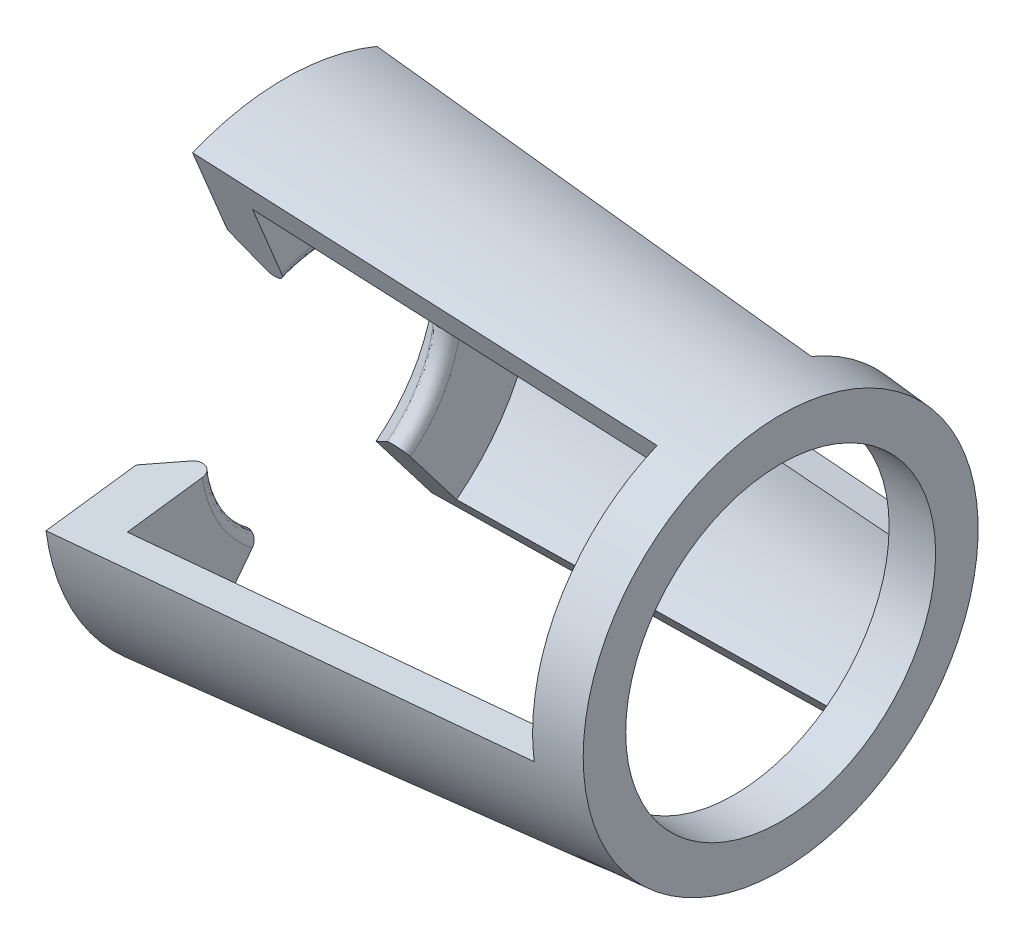
ISO-10303-21;
HEADER;
FILE_DESCRIPTION(('STEP AP214'),'2;1');
FILE_NAME('part.step','',(''),(''),'','','');
FILE_SCHEMA(('AUTOMOTIVE_DESIGN { 1 0 10303 214 1 1 1 1 }'));
ENDSEC;
DATA;
#1=APPLICATION_CONTEXT('core data for automotive mechanical design processes');
#2=APPLICATION_PROTOCOL_DEFINITION('international standard','automotive_design',2000,#1);
#3=PRODUCT_CONTEXT('',#1,'mechanical');
#4=PRODUCT('Part','Part','',(#3));
#5=PRODUCT_RELATED_PRODUCT_CATEGORY('part','',(#4));
#6=PRODUCT_DEFINITION_FORMATION('','',#4);
#7=PRODUCT_DEFINITION_CONTEXT('part definition',#1,'design');
#8=PRODUCT_DEFINITION('design','',#6,#7);
#9=PRODUCT_DEFINITION_SHAPE('','',#8);
#10=(LENGTH_UNIT() NAMED_UNIT(*) SI_UNIT(.MILLI.,.METRE.));
#11=(NAMED_UNIT(*) PLANE_ANGLE_UNIT() SI_UNIT($,.RADIAN.));
#12=(NAMED_UNIT(*) SI_UNIT($,.STERADIAN.) SOLID_ANGLE_UNIT());
#13=UNCERTAINTY_MEASURE_WITH_UNIT(LENGTH_MEASURE(1.E-05),#10,'distance_accuracy_value','');
#14=(GEOMETRIC_REPRESENTATION_CONTEXT(3) GLOBAL_UNCERTAINTY_ASSIGNED_CONTEXT((#13)) GLOBAL_UNIT_ASSIGNED_CONTEXT((#10,
#11,#12)) REPRESENTATION_CONTEXT('',''));
#15=CARTESIAN_POINT('',(0.,0.,0.));
#16=DIRECTION('',(0.,0.,1.));
#17=DIRECTION('',(1.,0.,0.));
#18=AXIS2_PLACEMENT_3D('',#15,#16,#17);
#19=CARTESIAN_POINT('',(0.75,-1.75521048802579,1.14446389126409));
#20=CARTESIAN_POINT('',(0.75,-1.72700261413181,1.18794201607092));
#21=CARTESIAN_POINT('',(0.75,-1.69609819179004,1.23175978207235));
#22=CARTESIAN_POINT('',(0.75,-1.32579916049826,1.71434282399508));
#23=CARTESIAN_POINT('',(0.75,-0.821764856126001,2.00534716530499));
#24=CARTESIAN_POINT('',(0.75,-0.218686166739589,2.08474401243922));
#25=CARTESIAN_POINT('',(0.75,-0.165286657074375,2.08959914427567));
#26=CARTESIAN_POINT('',(0.75,-0.11352955953576,2.09228881725127));
#27=CARTESIAN_POINT('',(0.750000000004493,-1.60300332677042,1.03923868519122));
#28=CARTESIAN_POINT('',(0.749999999662612,-1.57545568357828,1.08179000365184));
#29=CARTESIAN_POINT('',(0.74999999999999,-1.54626907845391,1.12308060245716));
#30=CARTESIAN_POINT('',(0.750000000000111,-1.20937959969953,1.56212352821814));
#31=CARTESIAN_POINT('',(0.749999999999891,-0.748148859435819,1.82841522026753));
#32=CARTESIAN_POINT('',(0.750000000000011,-0.199481792998441,1.90064860425603));
#33=CARTESIAN_POINT('',(0.749999999662585,-0.14912978293337,1.90527964634122));
#34=CARTESIAN_POINT('',(0.750000000004493,-0.098505438585886,1.90786094592976));
#35=CARTESIAN_POINT('',(0.579039085662711,-1.54477074274561,0.998980818191869));
#36=CARTESIAN_POINT('',(0.579064005045107,-1.51745422273521,1.04116597196559));
#37=CARTESIAN_POINT('',(0.579057233771362,-1.48893195908329,1.08149088096123));
#38=CARTESIAN_POINT('',(0.579057233576464,-1.16482776298836,1.50387172538826));
#39=CARTESIAN_POINT('',(0.579057233576354,-0.719977236724321,1.76070629647571));
#40=CARTESIAN_POINT('',(0.579057233771372,-0.192132597331981,1.83019834155326));
#41=CARTESIAN_POINT('',(0.579064005045108,-0.142949069910447,1.8347368919514));
#42=CARTESIAN_POINT('',(0.579039085662712,-0.0927573950746831,1.83730111533659));
#43=CARTESIAN_POINT('',(0.448224008012147,-1.65241976607726,1.07340169675101));
#44=CARTESIAN_POINT('',(0.44822303531754,-1.6246045938438,1.11622281132804));
#45=CARTESIAN_POINT('',(0.448223304437407,-1.5948771409127,1.15833866566105));
#46=CARTESIAN_POINT('',(0.448223307362948,-1.24714882637124,1.61150702322105));
#47=CARTESIAN_POINT('',(0.448223307362905,-0.772031607300428,1.88581607754808));
#48=CARTESIAN_POINT('',(0.448223304437412,-0.20571214019189,1.96037345277601));
#49=CARTESIAN_POINT('',(0.448223035317571,-0.154375013971805,1.96506025503762));
#50=CARTESIAN_POINT('',(0.448224008012147,-0.103383254813024,1.96773834351396));
#51=(BOUNDED_SURFACE() B_SPLINE_SURFACE(3,3,((#19,#20,#21,#22,#23,#24,#25,#26),(#27,#28,#29,#30,
#31,#32,#33,#34),(#35,#36,#37,#38,#39,#40,#41,#42),(#43,#44,#45,#46,#47,#48,#49,#50)),
.UNSPECIFIED.,.F.,.F.,.F.) B_SPLINE_SURFACE_WITH_KNOTS((4,4),(4,2,2,4),(0.,1.),
(-0.0999999999999994,0.,1.,1.1),
.UNSPECIFIED.) GEOMETRIC_REPRESENTATION_ITEM() RATIONAL_B_SPLINE_SURFACE(((1.,1.,1.,1.,1.,1.,1.,
1.),(0.588391783679867,0.588470534358269,0.588455621701443,0.588455620329532,0.588455620330206,
0.588455621701376,0.588470534358318,0.588391783679866),(0.588391783679867,0.588470534358269,
0.588455621701443,0.588455620329532,0.588455620330206,0.588455621701376,0.588470534358318,
0.588391783679866),(1.,1.,1.,1.,1.,1.,1.,1.))) REPRESENTATION_ITEM('') SURFACE());
#52=CARTESIAN_POINT('',(0.448224008012147,-1.65241976607726,1.07340169675101));
#53=CARTESIAN_POINT('',(0.44822303531754,-1.6246045938438,1.11622281132804));
#54=CARTESIAN_POINT('',(0.448223304437407,-1.5948771409127,1.15833866566105));
#55=CARTESIAN_POINT('',(0.448223307362948,-1.24714882637124,1.61150702322105));
#56=CARTESIAN_POINT('',(0.448223307362905,-0.772031607300428,1.88581607754808));
#57=CARTESIAN_POINT('',(0.448223304437412,-0.20571214019189,1.96037345277601));
#58=CARTESIAN_POINT('',(0.448223035317571,-0.154375013971805,1.96506025503762));
#59=CARTESIAN_POINT('',(0.448224008012147,-0.103383254813024,1.96773834351396));
#60=(BOUNDED_CURVE() B_SPLINE_CURVE(3,(#52,#53,#54,#55,#56,#57,#58,#59),.UNSPECIFIED.,.F.,
.F.) B_SPLINE_CURVE_WITH_KNOTS((4,2,2,4),(-0.0999999999999994,0.,1.,1.1),
.UNSPECIFIED.) CURVE() GEOMETRIC_REPRESENTATION_ITEM() RATIONAL_B_SPLINE_CURVE((1.,1.,1.,1.,1.,
1.,1.,1.)) REPRESENTATION_ITEM(''));
#61=CARTESIAN_POINT('',(0.448223304703364,-0.257195728110849,1.95359550957347));
#62=VERTEX_POINT('',#61);
#63=CARTESIAN_POINT('',(0.448147474307576,-1.56332563625218,1.1995819516957));
#64=VERTEX_POINT('',#63);
#65=EDGE_CURVE('E678',#62,#64,#60,.F.);
#66=CARTESIAN_POINT('',(0.448223304703366,-0.257195728110849,1.95359550957347));
#67=CARTESIAN_POINT('',(0.579057233753643,-0.240118473538728,1.82388088292323));
#68=CARTESIAN_POINT('',(0.75,-0.249360617114364,1.89408193299826));
#69=CARTESIAN_POINT('',(0.75,-0.273511502138354,2.0775261172452));
#70=(BOUNDED_CURVE() B_SPLINE_CURVE(3,(#66,#67,#68,#69),.UNSPECIFIED.,.F.,
.F.) B_SPLINE_CURVE_WITH_KNOTS((4,4),(0.,1.),
.UNSPECIFIED.) CURVE() GEOMETRIC_REPRESENTATION_ITEM() RATIONAL_B_SPLINE_CURVE((1.,
0.588455621576724,0.588455621576724,1.)) REPRESENTATION_ITEM(''));
#71=CARTESIAN_POINT('',(0.75,-0.273511502138354,2.0775261172452));
#72=VERTEX_POINT('',#71);
#73=EDGE_CURVE('E58',#72,#62,#70,.F.);
#74=CARTESIAN_POINT('',(0.75,-0.11352955953576,2.09228881725127));
#75=CARTESIAN_POINT('',(0.75,-0.165286657074375,2.08959914427567));
#76=CARTESIAN_POINT('',(0.75,-0.218686166739589,2.08474401243922));
#77=CARTESIAN_POINT('',(0.75,-0.821764856126001,2.00534716530499));
#78=CARTESIAN_POINT('',(0.75,-1.32579916049826,1.71434282399508));
#79=CARTESIAN_POINT('',(0.75,-1.69609819179004,1.23175978207235));
#80=CARTESIAN_POINT('',(0.75,-1.72700261413181,1.18794201607092));
#81=CARTESIAN_POINT('',(0.75,-1.75521048802579,1.14446389126409));
#82=(BOUNDED_CURVE() B_SPLINE_CURVE(3,(#74,#75,#76,#77,#78,#79,#80,#81),.UNSPECIFIED.,.F.,
.F.) B_SPLINE_CURVE_WITH_KNOTS((4,2,2,4),(-0.0999999999999994,0.,1.,1.1),
.UNSPECIFIED.) CURVE() GEOMETRIC_REPRESENTATION_ITEM() RATIONAL_B_SPLINE_CURVE((1.,1.,1.,1.,1.,
1.,1.,1.)) REPRESENTATION_ITEM(''));
#83=CARTESIAN_POINT('',(0.75,-1.66243464349079,1.27563096770169));
#84=VERTEX_POINT('',#83);
#85=EDGE_CURVE('E251',#84,#72,#82,.F.);
#86=CARTESIAN_POINT('',(0.75,-1.66243464349079,1.27563096770169));
#87=CARTESIAN_POINT('',(0.750000000000001,-1.51564276226842,1.16299359562356));
#88=CARTESIAN_POINT('',(0.579057233753644,-1.45946794131892,1.11988913946412));
#89=CARTESIAN_POINT('',(0.448223304703365,-1.56326547595439,1.1995357890756));
#90=(BOUNDED_CURVE() B_SPLINE_CURVE(3,(#86,#87,#88,#89),.UNSPECIFIED.,.F.,
.F.) B_SPLINE_CURVE_WITH_KNOTS((4,4),(0.,1.),
.UNSPECIFIED.) CURVE() GEOMETRIC_REPRESENTATION_ITEM() RATIONAL_B_SPLINE_CURVE((1.,
0.588455621576723,0.588455621576723,1.)) REPRESENTATION_ITEM(''));
#91=EDGE_CURVE('E11',#64,#84,#90,.F.);
#92=ORIENTED_EDGE('',*,*,#65,.F.);
#93=ORIENTED_EDGE('',*,*,#73,.F.);
#94=ORIENTED_EDGE('',*,*,#85,.F.);
#95=ORIENTED_EDGE('',*,*,#91,.F.);
#96=EDGE_LOOP('',(#92,#93,#94,#95));
#97=FACE_BOUND('',#96,.T.);
#98=ADVANCED_FACE('F44',(#97),#51,.T.);
#99=CARTESIAN_POINT('',(0.75,-0.113529559535791,-2.09228881725127));
#100=CARTESIAN_POINT('',(0.75,-0.165286657074389,-2.08959914427568));
#101=CARTESIAN_POINT('',(0.75,-0.218686166739633,-2.08474401243919));
#102=CARTESIAN_POINT('',(0.75,-0.821764856125882,-2.00534716530522));
#103=CARTESIAN_POINT('',(0.75,-1.32579916049847,-1.71434282399487));
#104=CARTESIAN_POINT('',(0.75,-1.69609819179004,-1.23175978207234));
#105=CARTESIAN_POINT('',(0.75,-1.72700261413187,-1.18794201607091));
#106=CARTESIAN_POINT('',(0.75,-1.75521048802581,-1.14446389126407));
#107=CARTESIAN_POINT('',(0.750000000004493,-0.0985054385859135,-1.90786094592976));
#108=CARTESIAN_POINT('',(0.749999999662618,-0.149129782933395,-1.90527964634124));
#109=CARTESIAN_POINT('',(0.750000000000022,-0.199481792998454,-1.900648604256));
#110=CARTESIAN_POINT('',(0.749999999999781,-0.748148859435051,-1.82841522026792));
#111=CARTESIAN_POINT('',(0.750000000000192,-1.2093795996997,-1.56212352821791));
#112=CARTESIAN_POINT('',(0.749999999999981,-1.54626907845392,-1.12308060245715));
#113=CARTESIAN_POINT('',(0.749999999662637,-1.57545568357831,-1.08179000365182));
#114=CARTESIAN_POINT('',(0.750000000004493,-1.60300332677044,-1.03923868519119));
#115=CARTESIAN_POINT('',(0.579039085662711,-0.0927573950747094,-1.83730111533659));
#116=CARTESIAN_POINT('',(0.579064005045132,-0.14294906991049,-1.83473689195137));
#117=CARTESIAN_POINT('',(0.57905723377138,-0.192132597331967,-1.83019834155325));
#118=CARTESIAN_POINT('',(0.579057233576271,-0.719977236723854,-1.76070629647593));
#119=CARTESIAN_POINT('',(0.579057233576545,-1.16482776298852,-1.50387172538781));
#120=CARTESIAN_POINT('',(0.579057233771352,-1.4889319590833,-1.08149088096124));
#121=CARTESIAN_POINT('',(0.579064005045151,-1.51745422273521,-1.04116597196552));
#122=CARTESIAN_POINT('',(0.579039085662711,-1.54477074274562,-0.998980818191847));
#123=CARTESIAN_POINT('',(0.448224008012146,-0.103383254813053,-1.96773834351396));
#124=CARTESIAN_POINT('',(0.448223035317593,-0.154375013971845,-1.9650602550376));
#125=CARTESIAN_POINT('',(0.448223304437421,-0.205712140191897,-1.960373452776));
#126=CARTESIAN_POINT('',(0.448223307362796,-0.772031607300662,-1.88581607754815));
#127=CARTESIAN_POINT('',(0.448223307363019,-1.24714882637144,-1.61150702322069));
#128=CARTESIAN_POINT('',(0.448223304437398,-1.5948771409127,-1.15833866566106));
#129=CARTESIAN_POINT('',(0.448223035317566,-1.62460459384381,-1.11622281132798));
#130=CARTESIAN_POINT('',(0.448224008012146,-1.65241976607728,-1.07340169675099));
#131=(BOUNDED_SURFACE() B_SPLINE_SURFACE(3,3,((#99,#100,#101,#102,#103,#104,#105,#106),(#107,
#108,#109,#110,#111,#112,#113,#114),(#115,#116,#117,#118,#119,#120,#121,#122),(#123,#124,#125,
#126,#127,#128,#129,#130)),.UNSPECIFIED.,.F.,.F.,.F.) B_SPLINE_SURFACE_WITH_KNOTS((4,4),(4,2,2,
4),(0.,1.),(-0.1,0.,1.,1.1),
.UNSPECIFIED.) GEOMETRIC_REPRESENTATION_ITEM() RATIONAL_B_SPLINE_SURFACE(((1.,1.,1.,1.,1.,1.,1.,
1.),(0.588391783679867,0.588470534358391,0.588455621701277,0.588455620331218,0.588455620329647,
0.588455621701434,0.588470534358274,0.588391783679867),(0.588391783679867,0.588470534358391,
0.588455621701277,0.588455620331218,0.588455620329647,0.588455621701434,0.588470534358274,
0.588391783679867),(1.,1.,1.,1.,1.,1.,1.,1.))) REPRESENTATION_ITEM('') SURFACE());
#132=CARTESIAN_POINT('',(0.448224008012146,-0.103383254813053,-1.96773834351396));
#133=CARTESIAN_POINT('',(0.448223035317593,-0.154375013971845,-1.9650602550376));
#134=CARTESIAN_POINT('',(0.448223304437421,-0.205712140191897,-1.960373452776));
#135=CARTESIAN_POINT('',(0.448223307362796,-0.772031607300662,-1.88581607754815));
#136=CARTESIAN_POINT('',(0.448223307363019,-1.24714882637144,-1.61150702322069));
#137=CARTESIAN_POINT('',(0.448223304437398,-1.5948771409127,-1.15833866566106));
#138=CARTESIAN_POINT('',(0.448223035317566,-1.62460459384381,-1.11622281132798));
#139=CARTESIAN_POINT('',(0.448224008012146,-1.65241976607728,-1.07340169675099));
#140=(BOUNDED_CURVE() B_SPLINE_CURVE(3,(#132,#133,#134,#135,#136,#137,#138,#139),.UNSPECIFIED.,
.F.,.F.) B_SPLINE_CURVE_WITH_KNOTS((4,2,2,4),(-0.1,0.,1.,1.1),
.UNSPECIFIED.) CURVE() GEOMETRIC_REPRESENTATION_ITEM() RATIONAL_B_SPLINE_CURVE((1.,1.,1.,1.,1.,
1.,1.,1.)) REPRESENTATION_ITEM(''));
#141=CARTESIAN_POINT('',(0.448223304703363,-1.56326547595441,-1.19953578907558));
#142=VERTEX_POINT('',#141);
#143=CARTESIAN_POINT('',(0.448147474313208,-0.257205625962958,-1.95367069122413));
#144=VERTEX_POINT('',#143);
#145=EDGE_CURVE('E311',#142,#144,#140,.F.);
#146=CARTESIAN_POINT('',(0.448223304703364,-1.5632654759544,-1.19953578907558));
#147=CARTESIAN_POINT('',(0.579057233753642,-1.45946794131894,-1.1198891394641));
#148=CARTESIAN_POINT('',(0.75,-1.51564276226844,-1.16299359562354));
#149=CARTESIAN_POINT('',(0.75,-1.66243464349081,-1.27563096770166));
#150=(BOUNDED_CURVE() B_SPLINE_CURVE(3,(#146,#147,#148,#149),.UNSPECIFIED.,.F.,
.F.) B_SPLINE_CURVE_WITH_KNOTS((4,4),(0.,1.),
.UNSPECIFIED.) CURVE() GEOMETRIC_REPRESENTATION_ITEM() RATIONAL_B_SPLINE_CURVE((1.,
0.588455621576726,0.588455621576726,1.)) REPRESENTATION_ITEM(''));
#151=CARTESIAN_POINT('',(0.75,-1.66243464349081,-1.27563096770167));
#152=VERTEX_POINT('',#151);
#153=EDGE_CURVE('E714',#152,#142,#150,.F.);
#154=CARTESIAN_POINT('',(0.75,-1.75521048802581,-1.14446389126407));
#155=CARTESIAN_POINT('',(0.75,-1.72700261413187,-1.18794201607091));
#156=CARTESIAN_POINT('',(0.75,-1.69609819179004,-1.23175978207234));
#157=CARTESIAN_POINT('',(0.75,-1.32579916049847,-1.71434282399487));
#158=CARTESIAN_POINT('',(0.75,-0.821764856125882,-2.00534716530522));
#159=CARTESIAN_POINT('',(0.75,-0.218686166739633,-2.08474401243919));
#160=CARTESIAN_POINT('',(0.75,-0.165286657074389,-2.08959914427568));
#161=CARTESIAN_POINT('',(0.75,-0.113529559535791,-2.09228881725127));
#162=(BOUNDED_CURVE() B_SPLINE_CURVE(3,(#154,#155,#156,#157,#158,#159,#160,#161),.UNSPECIFIED.,
.F.,.F.) B_SPLINE_CURVE_WITH_KNOTS((4,2,2,4),(-0.1,0.,1.,1.1),
.UNSPECIFIED.) CURVE() GEOMETRIC_REPRESENTATION_ITEM() RATIONAL_B_SPLINE_CURVE((1.,1.,1.,1.,1.,
1.,1.,1.)) REPRESENTATION_ITEM(''));
#163=CARTESIAN_POINT('',(0.75,-0.273511502138383,-2.0775261172452));
#164=VERTEX_POINT('',#163);
#165=EDGE_CURVE('E610',#164,#152,#162,.F.);
#166=CARTESIAN_POINT('',(0.75,-0.273511502138383,-2.0775261172452));
#167=CARTESIAN_POINT('',(0.75,-0.249360617114391,-1.89408193299826));
#168=CARTESIAN_POINT('',(0.579057233753642,-0.240118473538755,-1.82388088292323));
#169=CARTESIAN_POINT('',(0.448223304703364,-0.257195728110876,-1.95359550957347));
#170=(BOUNDED_CURVE() B_SPLINE_CURVE(3,(#166,#167,#168,#169),.UNSPECIFIED.,.F.,
.F.) B_SPLINE_CURVE_WITH_KNOTS((4,4),(0.,1.),
.UNSPECIFIED.) CURVE() GEOMETRIC_REPRESENTATION_ITEM() RATIONAL_B_SPLINE_CURVE((1.,
0.588455621576726,0.588455621576726,1.)) REPRESENTATION_ITEM(''));
#171=EDGE_CURVE('E297',#144,#164,#170,.F.);
#172=ORIENTED_EDGE('',*,*,#145,.F.);
#173=ORIENTED_EDGE('',*,*,#153,.F.);
#174=ORIENTED_EDGE('',*,*,#165,.F.);
#175=ORIENTED_EDGE('',*,*,#171,.F.);
#176=EDGE_LOOP('',(#172,#173,#174,#175));
#177=FACE_BOUND('',#176,.T.);
#178=ADVANCED_FACE('F318',(#177),#131,.T.);
#179=CARTESIAN_POINT('',(0.75,1.86874004756158,0.947824925987188));
#180=CARTESIAN_POINT('',(0.75,1.89228927120617,0.901657128204834));
#181=CARTESIAN_POINT('',(0.75,1.91478435852967,0.852984230366848));
#182=CARTESIAN_POINT('',(0.75,2.14756401662422,0.291004341310283));
#183=CARTESIAN_POINT('',(0.75,2.14756401662418,-0.291004341310247));
#184=CARTESIAN_POINT('',(0.75,1.91478435852967,-0.852984230366852));
#185=CARTESIAN_POINT('',(0.75,1.89228927120622,-0.901657128204855));
#186=CARTESIAN_POINT('',(0.75,1.86874004756158,-0.947824925987188));
#187=CARTESIAN_POINT('',(0.750000000004493,1.70150876535633,0.86862226073856));
#188=CARTESIAN_POINT('',(0.749999999662634,1.72458546651165,0.823489642689456));
#189=CARTESIAN_POINT('',(0.75,1.74575087145239,0.777568001798872));
#190=CARTESIAN_POINT('',(0.75,1.95752845913577,0.266291692050009));
#191=CARTESIAN_POINT('',(0.75,1.95752845913567,-0.266291692050141));
#192=CARTESIAN_POINT('',(0.75,1.7457508714524,-0.777568001798859));
#193=CARTESIAN_POINT('',(0.749999999662643,1.72458546651171,-0.823489642689499));
#194=CARTESIAN_POINT('',(0.750000000004493,1.70150876535633,-0.86862226073856));
#195=CARTESIAN_POINT('',(0.579039085662712,1.63752813782032,0.838320297144733));
#196=CARTESIAN_POINT('',(0.579064005045169,1.66040329264566,0.793570919985873));
#197=CARTESIAN_POINT('',(0.57905723377136,1.68106455641528,0.748707460592046));
#198=CARTESIAN_POINT('',(0.579057233576492,1.8848049997133,0.256834571087864));
#199=CARTESIAN_POINT('',(0.579057233576437,1.88480499971309,-0.256834571088024));
#200=CARTESIAN_POINT('',(0.579057233771365,1.6810645564153,-0.748707460592031));
#201=CARTESIAN_POINT('',(0.579064005045174,1.66040329264565,-0.793570919985891));
#202=CARTESIAN_POINT('',(0.579039085662712,1.63752813782032,-0.838320297144732));
#203=CARTESIAN_POINT('',(0.448224008012149,1.75580302089032,0.894336646762963));
#204=CARTESIAN_POINT('',(0.4482230353176,1.7789796078156,0.848837443709618));
#205=CARTESIAN_POINT('',(0.448223304437403,1.8005892811046,0.802034787114958));
#206=CARTESIAN_POINT('',(0.448223307363004,2.01918043367192,0.274309054327199));
#207=CARTESIAN_POINT('',(0.448223307363016,2.01918043367192,-0.27430905432718));
#208=CARTESIAN_POINT('',(0.448223304437402,1.8005892811046,-0.80203478711496));
#209=CARTESIAN_POINT('',(0.448223035317588,1.77897960781561,-0.848837443709621));
#210=CARTESIAN_POINT('',(0.448224008012149,1.75580302089032,-0.894336646762963));
#211=(BOUNDED_SURFACE() B_SPLINE_SURFACE(3,3,((#179,#180,#181,#182,#183,#184,#185,#186),(#187,
#188,#189,#190,#191,#192,#193,#194),(#195,#196,#197,#198,#199,#200,#201,#202),(#203,#204,#205,
#206,#207,#208,#209,#210)),.UNSPECIFIED.,.F.,.F.,.F.) B_SPLINE_SURFACE_WITH_KNOTS((4,4),(4,2,2,
4),(0.,1.),(-0.0999999999999999,0.,1.,1.1),
.UNSPECIFIED.) GEOMETRIC_REPRESENTATION_ITEM() RATIONAL_B_SPLINE_SURFACE(((1.,1.,1.,1.,1.,1.,1.,
1.),(0.588391783679867,0.588470534358312,0.588455621701384,0.588455620330153,0.588455620330153,
0.588455621701384,0.588470534358313,0.588391783679867),(0.588391783679867,0.588470534358312,
0.588455621701384,0.588455620330153,0.588455620330153,0.588455621701384,0.588470534358313,
0.588391783679867),(1.,1.,1.,1.,1.,1.,1.,1.))) REPRESENTATION_ITEM('') SURFACE());
#212=CARTESIAN_POINT('',(0.448224008012149,1.75580302089032,0.894336646762963));
#213=CARTESIAN_POINT('',(0.4482230353176,1.7789796078156,0.848837443709618));
#214=CARTESIAN_POINT('',(0.448223304437403,1.8005892811046,0.802034787114958));
#215=CARTESIAN_POINT('',(0.448223307363004,2.01918043367192,0.274309054327199));
#216=CARTESIAN_POINT('',(0.448223307363016,2.01918043367192,-0.27430905432718));
#217=CARTESIAN_POINT('',(0.448223304437402,1.8005892811046,-0.80203478711496));
#218=CARTESIAN_POINT('',(0.448223035317588,1.77897960781561,-0.848837443709621));
#219=CARTESIAN_POINT('',(0.448224008012149,1.75580302089032,-0.894336646762963));
#220=(BOUNDED_CURVE() B_SPLINE_CURVE(3,(#212,#213,#214,#215,#216,#217,#218,#219),.UNSPECIFIED.,
.F.,.F.) B_SPLINE_CURVE_WITH_KNOTS((4,2,2,4),(-0.0999999999999999,0.,1.,1.1),
.UNSPECIFIED.) CURVE() GEOMETRIC_REPRESENTATION_ITEM() RATIONAL_B_SPLINE_CURVE((1.,1.,1.,1.,1.,
1.,1.,1.)) REPRESENTATION_ITEM(''));
#221=CARTESIAN_POINT('',(0.448223304703366,1.82046120406527,-0.75405972049789));
#222=VERTEX_POINT('',#221);
#223=CARTESIAN_POINT('',(0.448147474312111,1.82053126221169,0.754088739532293));
#224=VERTEX_POINT('',#223);
#225=EDGE_CURVE('E445',#222,#224,#220,.F.);
#226=CARTESIAN_POINT('',(0.448223304703367,1.82046120406526,-0.754059720497889));
#227=CARTESIAN_POINT('',(0.579057233753644,1.69958641485768,-0.703991743459119));
#228=CARTESIAN_POINT('',(0.75,1.76500337938282,-0.73108833737471));
#229=CARTESIAN_POINT('',(0.75,1.93594614562917,-0.801895149543524));
#230=(BOUNDED_CURVE() B_SPLINE_CURVE(3,(#226,#227,#228,#229),.UNSPECIFIED.,.F.,
.F.) B_SPLINE_CURVE_WITH_KNOTS((4,4),(0.,1.),
.UNSPECIFIED.) CURVE() GEOMETRIC_REPRESENTATION_ITEM() RATIONAL_B_SPLINE_CURVE((1.,
0.588455621576727,0.588455621576727,1.)) REPRESENTATION_ITEM(''));
#231=CARTESIAN_POINT('',(0.75,1.93594614562918,-0.801895149543525));
#232=VERTEX_POINT('',#231);
#233=EDGE_CURVE('E440',#232,#222,#230,.F.);
#234=CARTESIAN_POINT('',(0.75,1.86874004756158,-0.947824925987188));
#235=CARTESIAN_POINT('',(0.75,1.89228927120622,-0.901657128204855));
#236=CARTESIAN_POINT('',(0.75,1.91478435852967,-0.852984230366852));
#237=CARTESIAN_POINT('',(0.75,2.14756401662418,-0.291004341310247));
#238=CARTESIAN_POINT('',(0.75,2.14756401662422,0.291004341310283));
#239=CARTESIAN_POINT('',(0.75,1.91478435852967,0.852984230366848));
#240=CARTESIAN_POINT('',(0.75,1.89228927120617,0.901657128204834));
#241=CARTESIAN_POINT('',(0.75,1.86874004756158,0.947824925987188));
#242=(BOUNDED_CURVE() B_SPLINE_CURVE(3,(#234,#235,#236,#237,#238,#239,#240,#241),.UNSPECIFIED.,
.F.,.F.) B_SPLINE_CURVE_WITH_KNOTS((4,2,2,4),(-0.0999999999999999,0.,1.,1.1),
.UNSPECIFIED.) CURVE() GEOMETRIC_REPRESENTATION_ITEM() RATIONAL_B_SPLINE_CURVE((1.,1.,1.,1.,1.,
1.,1.,1.)) REPRESENTATION_ITEM(''));
#243=CARTESIAN_POINT('',(0.75,1.93594614562918,0.801895149543526));
#244=VERTEX_POINT('',#243);
#245=EDGE_CURVE('E442',#244,#232,#242,.F.);
#246=CARTESIAN_POINT('',(0.75,1.93594614562917,0.801895149543525));
#247=CARTESIAN_POINT('',(0.75,1.76500337938282,0.731088337374711));
#248=CARTESIAN_POINT('',(0.579057233753644,1.69958641485768,0.703991743459119));
#249=CARTESIAN_POINT('',(0.448223304703367,1.82046120406526,0.754059720497889));
#250=(BOUNDED_CURVE() B_SPLINE_CURVE(3,(#246,#247,#248,#249),.UNSPECIFIED.,.F.,
.F.) B_SPLINE_CURVE_WITH_KNOTS((4,4),(0.,1.),
.UNSPECIFIED.) CURVE() GEOMETRIC_REPRESENTATION_ITEM() RATIONAL_B_SPLINE_CURVE((1.,
0.588455621576727,0.588455621576727,1.)) REPRESENTATION_ITEM(''));
#251=EDGE_CURVE('E451',#224,#244,#250,.F.);
#252=ORIENTED_EDGE('',*,*,#225,.F.);
#253=ORIENTED_EDGE('',*,*,#233,.F.);
#254=ORIENTED_EDGE('',*,*,#245,.F.);
#255=ORIENTED_EDGE('',*,*,#251,.F.);
#256=EDGE_LOOP('',(#252,#253,#254,#255));
#257=FACE_BOUND('',#256,.T.);
#258=ADVANCED_FACE('F331',(#257),#211,.T.);
#259=CARTESIAN_POINT('',(7.25,0.,0.));
#260=DIRECTION('',(-1.,0.,0.));
#261=DIRECTION('',(0.,0.,1.));
#262=AXIS2_PLACEMENT_3D('',#259,#260,#261);
#263=PLANE('',#262);
#264=DIRECTION('',(0.,-0.79335334029123,0.608761429008728));
#265=VECTOR('',#264,1.);
#266=CARTESIAN_POINT('',(7.25,0.,0.));
#267=LINE('',#266,#265);
#268=CARTESIAN_POINT('',(7.25,-2.18172168580088,1.674093929774));
#269=VERTEX_POINT('',#268);
#270=CARTESIAN_POINT('',(7.25,-2.57991359638369,1.9796373291591));
#271=VERTEX_POINT('',#270);
#272=EDGE_CURVE('E654',#269,#271,#267,.T.);
#273=ORIENTED_EDGE('',*,*,#272,.F.);
#274=CARTESIAN_POINT('',(7.25,0.,0.));
#275=DIRECTION('',(-1.,0.,0.));
#276=DIRECTION('',(0.,-0.866025403784443,-0.499999999999992));
#277=AXIS2_PLACEMENT_3D('',#274,#275,#276);
#278=CIRCLE('',#277,2.75);
#279=CARTESIAN_POINT('',(7.25,-0.358947028605114,2.72647336877798));
#280=VERTEX_POINT('',#279);
#281=EDGE_CURVE('E216',#269,#280,#278,.T.);
#282=ORIENTED_EDGE('',*,*,#281,.T.);
#283=DIRECTION('',(0.,-0.130526192220042,0.991444861373812));
#284=VECTOR('',#283,1.);
#285=CARTESIAN_POINT('',(7.25,0.,0.));
#286=LINE('',#285,#284);
#287=CARTESIAN_POINT('',(7.25,-0.424459419139851,3.22408937861671));
#288=VERTEX_POINT('',#287);
#289=EDGE_CURVE('E212',#280,#288,#286,.T.);
#290=ORIENTED_EDGE('',*,*,#289,.T.);
#291=CARTESIAN_POINT('',(7.25,0.,0.));
#292=DIRECTION('',(-1.,0.,0.));
#293=DIRECTION('',(0.,0.,1.));
#294=AXIS2_PLACEMENT_3D('',#291,#292,#293);
#295=CIRCLE('',#294,3.25190991877167);
#296=CARTESIAN_POINT('',(7.25,3.00437301552359,1.24445204945763));
#297=VERTEX_POINT('',#296);
#298=EDGE_CURVE('E193',#288,#297,#295,.T.);
#299=ORIENTED_EDGE('',*,*,#298,.T.);
#300=DIRECTION('',(0.,0.923879532511287,0.382683432365091));
#301=VECTOR('',#300,1.);
#302=CARTESIAN_POINT('',(7.25,0.,0.));
#303=LINE('',#302,#301);
#304=CARTESIAN_POINT('',(7.25,2.54066871440604,1.052379439004));
#305=VERTEX_POINT('',#304);
#306=EDGE_CURVE('E473',#305,#297,#303,.T.);
#307=ORIENTED_EDGE('',*,*,#306,.F.);
#308=CARTESIAN_POINT('',(7.25,0.,0.));
#309=DIRECTION('',(-1.,0.,0.));
#310=DIRECTION('',(0.,0.,1.));
#311=AXIS2_PLACEMENT_3D('',#308,#309,#310);
#312=CIRCLE('',#311,2.75);
#313=CARTESIAN_POINT('',(7.25,2.54066871440604,-1.052379439004));
#314=VERTEX_POINT('',#313);
#315=EDGE_CURVE('E208',#305,#314,#312,.T.);
#316=ORIENTED_EDGE('',*,*,#315,.T.);
#317=DIRECTION('',(0.,0.923879532511287,-0.382683432365091));
#318=VECTOR('',#317,1.);
#319=CARTESIAN_POINT('',(7.25,0.,0.));
#320=LINE('',#319,#318);
#321=CARTESIAN_POINT('',(7.25,3.00437301552359,-1.24445204945763));
#322=VERTEX_POINT('',#321);
#323=EDGE_CURVE('E550',#314,#322,#320,.T.);
#324=ORIENTED_EDGE('',*,*,#323,.T.);
#325=CARTESIAN_POINT('',(7.25,-0.424459419139895,-3.2240893786167));
#326=VERTEX_POINT('',#325);
#327=EDGE_CURVE('E210',#322,#326,#295,.T.);
#328=ORIENTED_EDGE('',*,*,#327,.T.);
#329=DIRECTION('',(0.,-0.130526192220055,-0.99144486137381));
#330=VECTOR('',#329,1.);
#331=CARTESIAN_POINT('',(7.25,0.,0.));
#332=LINE('',#331,#330);
#333=CARTESIAN_POINT('',(7.25,-0.358947028605152,-2.72647336877798));
#334=VERTEX_POINT('',#333);
#335=EDGE_CURVE('E565',#334,#326,#332,.T.);
#336=ORIENTED_EDGE('',*,*,#335,.F.);
#337=CARTESIAN_POINT('',(7.25,0.,0.));
#338=DIRECTION('',(-1.,0.,0.));
#339=DIRECTION('',(0.,0.866025403784436,-0.500000000000004));
#340=AXIS2_PLACEMENT_3D('',#337,#338,#339);
#341=CIRCLE('',#340,2.75);
#342=CARTESIAN_POINT('',(7.25,-2.18172168580091,-1.67409392977397));
#343=VERTEX_POINT('',#342);
#344=EDGE_CURVE('E606',#334,#343,#341,.T.);
#345=ORIENTED_EDGE('',*,*,#344,.T.);
#346=DIRECTION('',(0.,-0.793353340291239,-0.608761429008717));
#347=VECTOR('',#346,1.);
#348=CARTESIAN_POINT('',(7.25,0.,0.));
#349=LINE('',#348,#347);
#350=CARTESIAN_POINT('',(7.25,-2.57991359638372,-1.97963732915906));
#351=VERTEX_POINT('',#350);
#352=EDGE_CURVE('E628',#343,#351,#349,.T.);
#353=ORIENTED_EDGE('',*,*,#352,.T.);
#354=EDGE_CURVE('E207',#351,#271,#295,.T.);
#355=ORIENTED_EDGE('',*,*,#354,.T.);
#356=EDGE_LOOP('',(#273,#282,#290,#299,#307,#316,#324,#328,#336,#345,#353,#355));
#357=FACE_BOUND('',#356,.T.);
#358=CARTESIAN_POINT('',(7.25,0.,0.));
#359=DIRECTION('',(-1.,0.,0.));
#360=DIRECTION('',(0.,0.,1.));
#361=AXIS2_PLACEMENT_3D('',#358,#359,#360);
#362=CIRCLE('',#361,2.5);
#363=CARTESIAN_POINT('',(7.25,0.,2.5));
#364=VERTEX_POINT('',#363);
#365=EDGE_CURVE('E511',#364,#364,#362,.T.);
#366=ORIENTED_EDGE('',*,*,#365,.F.);
#367=EDGE_LOOP('',(#366));
#368=FACE_BOUND('',#367,.T.);
#369=ADVANCED_FACE('F213',(#357,#368),#263,.T.);
#370=CARTESIAN_POINT('',(0.,0.,0.));
#371=DIRECTION('',(-1.,0.,0.));
#372=DIRECTION('',(0.,0.,1.));
#373=AXIS2_PLACEMENT_3D('',#370,#371,#372);
#374=CYLINDRICAL_SURFACE('',#373,2.5);
#375=ORIENTED_EDGE('',*,*,#365,.T.);
#376=EDGE_LOOP('',(#375));
#377=FACE_BOUND('',#376,.T.);
#378=CARTESIAN_POINT('',(8.,0.,0.));
#379=DIRECTION('',(-1.,0.,0.));
#380=DIRECTION('',(0.,0.,1.));
#381=AXIS2_PLACEMENT_3D('',#378,#379,#380);
#382=CIRCLE('',#381,2.5);
#383=CARTESIAN_POINT('',(8.,0.,2.5));
#384=VERTEX_POINT('',#383);
#385=EDGE_CURVE('E507',#384,#384,#382,.T.);
#386=ORIENTED_EDGE('',*,*,#385,.F.);
#387=EDGE_LOOP('',(#386));
#388=FACE_BOUND('',#387,.T.);
#389=ADVANCED_FACE('F752',(#377,#388),#374,.F.);
#390=CARTESIAN_POINT('',(8.,0.,0.));
#391=DIRECTION('',(1.,0.,0.));
#392=DIRECTION('',(0.,0.,-1.));
#393=AXIS2_PLACEMENT_3D('',#390,#391,#392);
#394=PLANE('',#393);
#395=ORIENTED_EDGE('',*,*,#385,.T.);
#396=EDGE_LOOP('',(#395));
#397=FACE_BOUND('',#396,.T.);
#398=CARTESIAN_POINT('',(8.,0.,0.));
#399=DIRECTION('',(-1.,0.,0.));
#400=DIRECTION('',(0.,0.,1.));
#401=AXIS2_PLACEMENT_3D('',#398,#399,#400);
#402=CIRCLE('',#401,3.18629342112723);
#403=CARTESIAN_POINT('',(8.,0.,3.18629342112723));
#404=VERTEX_POINT('',#403);
#405=EDGE_CURVE('E503',#404,#404,#402,.T.);
#406=ORIENTED_EDGE('',*,*,#405,.F.);
#407=EDGE_LOOP('',(#406));
#408=FACE_BOUND('',#407,.T.);
#409=ADVANCED_FACE('F758',(#397,#408),#394,.T.);
#410=CARTESIAN_POINT('',(7.25,0.,0.));
#411=DIRECTION('',(-1.,0.,0.));
#412=DIRECTION('',(0.,0.,1.));
#413=AXIS2_PLACEMENT_3D('',#410,#411,#412);
#414=CONICAL_SURFACE('',#413,3.25190991877167,0.0872664625997172);
#415=ORIENTED_EDGE('',*,*,#405,.T.);
#416=EDGE_LOOP('',(#415));
#417=FACE_BOUND('',#416,.T.);
#418=ORIENTED_EDGE('',*,*,#327,.F.);
#419=DIRECTION('',(0.996194698091746,-0.0805214068653807,0.0333530587850028));
#420=VECTOR('',#419,1.);
#421=CARTESIAN_POINT('',(0.337416010996605,3.56311016694175,-1.47588855537674));
#422=LINE('',#421,#420);
#423=CARTESIAN_POINT('',(0.,3.59038316082176,-1.48718539932836));
#424=VERTEX_POINT('',#423);
#425=EDGE_CURVE('E475',#424,#322,#422,.T.);
#426=ORIENTED_EDGE('',*,*,#425,.F.);
#427=CARTESIAN_POINT('',(0.,0.,0.));
#428=DIRECTION('',(-1.,0.,0.));
#429=DIRECTION('',(0.,0.,1.));
#430=AXIS2_PLACEMENT_3D('',#427,#428,#429);
#431=CIRCLE('',#430,3.88620272933463);
#432=CARTESIAN_POINT('',(0.,3.59038316082176,1.48718539932836));
#433=VERTEX_POINT('',#432);
#434=EDGE_CURVE('E495',#433,#424,#431,.T.);
#435=ORIENTED_EDGE('',*,*,#434,.F.);
#436=DIRECTION('',(0.996194698091746,-0.0805214068653807,-0.0333530587850028));
#437=VECTOR('',#436,1.);
#438=CARTESIAN_POINT('',(0.337416010996605,3.56311016694175,1.47588855537674));
#439=LINE('',#438,#437);
#440=EDGE_CURVE('E202',#433,#297,#439,.T.);
#441=ORIENTED_EDGE('',*,*,#440,.T.);
#442=ORIENTED_EDGE('',*,*,#298,.F.);
#443=DIRECTION('',(0.996194698091746,0.0113761072309614,-0.0864101132863839));
#444=VECTOR('',#443,1.);
#445=CARTESIAN_POINT('',(0.337416010996605,-0.503398101359868,3.82368819874254));
#446=LINE('',#445,#444);
#447=CARTESIAN_POINT('',(0.,-0.507251244455181,3.8529557262557));
#448=VERTEX_POINT('',#447);
#449=EDGE_CURVE('E199',#448,#288,#446,.T.);
#450=ORIENTED_EDGE('',*,*,#449,.F.);
#451=CARTESIAN_POINT('',(0.,0.,0.));
#452=DIRECTION('',(-1.,0.,0.));
#453=DIRECTION('',(0.,-0.866025403784443,-0.499999999999992));
#454=AXIS2_PLACEMENT_3D('',#451,#452,#453);
#455=CIRCLE('',#454,3.88620272933463);
#456=CARTESIAN_POINT('',(0.,-3.08313191636652,2.36577032692736));
#457=VERTEX_POINT('',#456);
#458=EDGE_CURVE('E641',#457,#448,#455,.T.);
#459=ORIENTED_EDGE('',*,*,#458,.F.);
#460=DIRECTION('',(0.996194698091746,0.069145299634418,-0.0530570545013816));
#461=VECTOR('',#460,1.);
#462=CARTESIAN_POINT('',(0.337416010996605,-3.05971206558183,2.34779964336583));
#463=LINE('',#462,#461);
#464=EDGE_CURVE('E651',#457,#271,#463,.T.);
#465=ORIENTED_EDGE('',*,*,#464,.T.);
#466=ORIENTED_EDGE('',*,*,#354,.F.);
#467=DIRECTION('',(0.996194698091746,0.0691452996344188,0.0530570545013807));
#468=VECTOR('',#467,1.);
#469=CARTESIAN_POINT('',(0.337416010996605,-3.05971206558186,-2.34779964336579));
#470=LINE('',#469,#468);
#471=CARTESIAN_POINT('',(0.,-3.08313191636655,-2.36577032692732));
#472=VERTEX_POINT('',#471);
#473=EDGE_CURVE('E633',#472,#351,#470,.T.);
#474=ORIENTED_EDGE('',*,*,#473,.F.);
#475=CARTESIAN_POINT('',(0.,0.,0.));
#476=DIRECTION('',(-1.,0.,0.));
#477=DIRECTION('',(0.,0.866025403784436,-0.500000000000004));
#478=AXIS2_PLACEMENT_3D('',#475,#476,#477);
#479=CIRCLE('',#478,3.88620272933463);
#480=CARTESIAN_POINT('',(0.,-0.507251244455235,-3.85295572625569));
#481=VERTEX_POINT('',#480);
#482=EDGE_CURVE('E561',#481,#472,#479,.T.);
#483=ORIENTED_EDGE('',*,*,#482,.F.);
#484=DIRECTION('',(0.996194698091746,0.0113761072309626,0.0864101132863838));
#485=VECTOR('',#484,1.);
#486=CARTESIAN_POINT('',(0.337416010996605,-0.503398101359921,-3.82368819874254));
#487=LINE('',#486,#485);
#488=EDGE_CURVE('E558',#481,#326,#487,.T.);
#489=ORIENTED_EDGE('',*,*,#488,.T.);
#490=EDGE_LOOP('',(#418,#426,#435,#441,#442,#450,#459,#465,#466,#474,#483,#489));
#491=FACE_BOUND('',#490,.T.);
#492=ADVANCED_FACE('F196',(#417,#491),#414,.T.);
#493=CARTESIAN_POINT('',(7.25,0.,0.));
#494=DIRECTION('',(-1.,0.,0.));
#495=DIRECTION('',(0.,0.,1.));
#496=AXIS2_PLACEMENT_3D('',#493,#494,#495);
#497=CONICAL_SURFACE('',#496,2.75,0.0872664625997165);
#498=ORIENTED_EDGE('',*,*,#315,.F.);
#499=DIRECTION('',(-0.996194698091746,0.0805214068653804,0.0333530587850027));
#500=VECTOR('',#499,1.);
#501=CARTESIAN_POINT('',(0.293838139622775,3.10292822096014,1.28527495219191));
#502=LINE('',#501,#500);
#503=CARTESIAN_POINT('',(0.75,3.06605712053543,1.27000244233638));
#504=VERTEX_POINT('',#503);
#505=EDGE_CURVE('E467',#305,#504,#502,.T.);
#506=ORIENTED_EDGE('',*,*,#505,.T.);
#507=CARTESIAN_POINT('',(0.75,0.,0.));
#508=DIRECTION('',(-1.,0.,0.));
#509=DIRECTION('',(0.,0.,1.));
#510=AXIS2_PLACEMENT_3D('',#507,#508,#509);
#511=CIRCLE('',#510,3.31867631291851);
#512=CARTESIAN_POINT('',(0.75,3.06605712053543,-1.27000244233638));
#513=VERTEX_POINT('',#512);
#514=EDGE_CURVE('E492',#504,#513,#511,.T.);
#515=ORIENTED_EDGE('',*,*,#514,.T.);
#516=DIRECTION('',(-0.996194698091746,0.0805214068653804,-0.0333530587850027));
#517=VECTOR('',#516,1.);
#518=CARTESIAN_POINT('',(0.293838139622775,3.10292822096014,-1.28527495219191));
#519=LINE('',#518,#517);
#520=EDGE_CURVE('E465',#314,#513,#519,.T.);
#521=ORIENTED_EDGE('',*,*,#520,.F.);
#522=EDGE_LOOP('',(#498,#506,#515,#521));
#523=FACE_BOUND('',#522,.T.);
#524=ADVANCED_FACE('F773',(#523),#497,.F.);
#525=CARTESIAN_POINT('',(0.,0.,0.));
#526=DIRECTION('',(-1.,0.,0.));
#527=DIRECTION('',(0.,0.,1.));
#528=AXIS2_PLACEMENT_3D('',#525,#526,#527);
#529=PLANE('',#528);
#530=DIRECTION('',(0.,0.923879532511287,-0.382683432365091));
#531=VECTOR('',#530,1.);
#532=CARTESIAN_POINT('',(0.,0.,0.));
#533=LINE('',#532,#531);
#534=CARTESIAN_POINT('',(0.,2.23456554127528,-0.925587353207798));
#535=VERTEX_POINT('',#534);
#536=EDGE_CURVE('E468',#535,#424,#533,.T.);
#537=ORIENTED_EDGE('',*,*,#536,.F.);
#538=CARTESIAN_POINT('',(0.,0.,0.));
#539=DIRECTION('',(-1.,0.,0.));
#540=DIRECTION('',(0.,0.,1.));
#541=AXIS2_PLACEMENT_3D('',#538,#539,#540);
#542=CIRCLE('',#541,2.41867631291851);
#543=CARTESIAN_POINT('',(0.,2.23456554127528,0.925587353207798));
#544=VERTEX_POINT('',#543);
#545=EDGE_CURVE('E518',#535,#544,#542,.F.);
#546=ORIENTED_EDGE('',*,*,#545,.T.);
#547=DIRECTION('',(0.,0.923879532511287,0.382683432365091));
#548=VECTOR('',#547,1.);
#549=CARTESIAN_POINT('',(0.,0.,0.));
#550=LINE('',#549,#548);
#551=EDGE_CURVE('E488',#544,#433,#550,.T.);
#552=ORIENTED_EDGE('',*,*,#551,.T.);
#553=ORIENTED_EDGE('',*,*,#434,.T.);
#554=EDGE_LOOP('',(#537,#546,#552,#553));
#555=FACE_BOUND('',#554,.T.);
#556=ADVANCED_FACE('F547',(#555),#529,.T.);
#557=CARTESIAN_POINT('',(0.75,0.,0.));
#558=DIRECTION('',(1.,0.,0.));
#559=DIRECTION('',(0.,0.,-1.));
#560=AXIS2_PLACEMENT_3D('',#557,#558,#559);
#561=PLANE('',#560);
#562=DIRECTION('',(0.,-0.923879532511287,-0.382683432365091));
#563=VECTOR('',#562,1.);
#564=CARTESIAN_POINT('',(0.75,0.,0.));
#565=LINE('',#564,#563);
#566=EDGE_CURVE('E458',#504,#244,#565,.T.);
#567=ORIENTED_EDGE('',*,*,#566,.T.);
#568=ORIENTED_EDGE('',*,*,#245,.T.);
#569=DIRECTION('',(0.,-0.923879532511287,0.382683432365091));
#570=VECTOR('',#569,1.);
#571=CARTESIAN_POINT('',(0.75,0.,0.));
#572=LINE('',#571,#570);
#573=EDGE_CURVE('E456',#513,#232,#572,.T.);
#574=ORIENTED_EDGE('',*,*,#573,.F.);
#575=ORIENTED_EDGE('',*,*,#514,.F.);
#576=EDGE_LOOP('',(#567,#568,#574,#575));
#577=FACE_BOUND('',#576,.T.);
#578=ADVANCED_FACE('F455',(#577),#561,.T.);
#579=CARTESIAN_POINT('',(0.,0.,0.));
#580=DIRECTION('',(0.,-0.382683432365091,0.923879532511287));
#581=DIRECTION('',(1.,0.,0.));
#582=AXIS2_PLACEMENT_3D('',#579,#580,#581);
#583=PLANE('',#582);
#584=DIRECTION('',(-0.707106781186547,0.653281482438189,0.270598050073099));
#585=VECTOR('',#584,1.);
#586=CARTESIAN_POINT('',(2.41867631291851,0.,0.));
#587=LINE('',#586,#585);
#588=EDGE_CURVE('E524',#544,#224,#587,.F.);
#589=ORIENTED_EDGE('',*,*,#588,.T.);
#590=ORIENTED_EDGE('',*,*,#251,.T.);
#591=ORIENTED_EDGE('',*,*,#566,.F.);
#592=ORIENTED_EDGE('',*,*,#505,.F.);
#593=ORIENTED_EDGE('',*,*,#306,.T.);
#594=ORIENTED_EDGE('',*,*,#440,.F.);
#595=ORIENTED_EDGE('',*,*,#551,.F.);
#596=EDGE_LOOP('',(#589,#590,#591,#592,#593,#594,#595));
#597=FACE_BOUND('',#596,.T.);
#598=ADVANCED_FACE('F539',(#597),#583,.T.);
#599=CARTESIAN_POINT('',(0.,0.,0.));
#600=DIRECTION('',(0.,0.382683432365091,0.923879532511287));
#601=DIRECTION('',(1.,0.,0.));
#602=AXIS2_PLACEMENT_3D('',#599,#600,#601);
#603=PLANE('',#602);
#604=ORIENTED_EDGE('',*,*,#573,.T.);
#605=ORIENTED_EDGE('',*,*,#233,.T.);
#606=DIRECTION('',(-0.707106781186547,0.653281482438189,-0.270598050073099));
#607=VECTOR('',#606,1.);
#608=CARTESIAN_POINT('',(2.41867631291851,0.,0.));
#609=LINE('',#608,#607);
#610=EDGE_CURVE('E515',#222,#535,#609,.T.);
#611=ORIENTED_EDGE('',*,*,#610,.T.);
#612=ORIENTED_EDGE('',*,*,#536,.T.);
#613=ORIENTED_EDGE('',*,*,#425,.T.);
#614=ORIENTED_EDGE('',*,*,#323,.F.);
#615=ORIENTED_EDGE('',*,*,#520,.T.);
#616=EDGE_LOOP('',(#604,#605,#611,#612,#613,#614,#615));
#617=FACE_BOUND('',#616,.T.);
#618=ADVANCED_FACE('F463',(#617),#603,.F.);
#619=CARTESIAN_POINT('',(0.500000000000003,0.,0.));
#620=DIRECTION('',(-1.,0.,0.));
#621=DIRECTION('',(0.,0.,1.));
#622=AXIS2_PLACEMENT_3D('',#619,#620,#621);
#623=CONICAL_SURFACE('',#622,1.91867631291851,0.785398163397449);
#624=ORIENTED_EDGE('',*,*,#610,.F.);
#625=ORIENTED_EDGE('',*,*,#225,.T.);
#626=ORIENTED_EDGE('',*,*,#588,.F.);
#627=ORIENTED_EDGE('',*,*,#545,.F.);
#628=EDGE_LOOP('',(#624,#625,#626,#627));
#629=FACE_BOUND('',#628,.T.);
#630=ADVANCED_FACE('F409',(#629),#623,.F.);
#631=CARTESIAN_POINT('',(7.25,0.,0.));
#632=DIRECTION('',(-1.,0.,0.));
#633=DIRECTION('',(0.,0.866025403784436,-0.500000000000004));
#634=AXIS2_PLACEMENT_3D('',#631,#632,#633);
#635=CONICAL_SURFACE('',#634,2.75,0.0872664625997165);
#636=ORIENTED_EDGE('',*,*,#344,.F.);
#637=DIRECTION('',(-0.996194698091746,-0.0113761072309625,-0.0864101132863835));
#638=VECTOR('',#637,1.);
#639=CARTESIAN_POINT('',(0.293838139622775,-0.438383351034059,-3.32985214156709));
#640=LINE('',#639,#638);
#641=CARTESIAN_POINT('',(0.75,-0.433174182336146,-3.29028457700604));
#642=VERTEX_POINT('',#641);
#643=EDGE_CURVE('E572',#334,#642,#640,.T.);
#644=ORIENTED_EDGE('',*,*,#643,.T.);
#645=CARTESIAN_POINT('',(0.75,0.,0.));
#646=DIRECTION('',(-1.,0.,0.));
#647=DIRECTION('',(0.,0.866025403784436,-0.500000000000004));
#648=AXIS2_PLACEMENT_3D('',#645,#646,#647);
#649=CIRCLE('',#648,3.31867631291851);
#650=CARTESIAN_POINT('',(0.75,-2.63288293819931,-2.02028213466965));
#651=VERTEX_POINT('',#650);
#652=EDGE_CURVE('E578',#642,#651,#649,.T.);
#653=ORIENTED_EDGE('',*,*,#652,.T.);
#654=DIRECTION('',(-0.996194698091746,-0.0691452996344186,-0.0530570545013805));
#655=VECTOR('',#654,1.);
#656=CARTESIAN_POINT('',(0.293838139622775,-2.66454486992611,-2.04457718937517));
#657=LINE('',#656,#655);
#658=EDGE_CURVE('E630',#343,#651,#657,.T.);
#659=ORIENTED_EDGE('',*,*,#658,.F.);
#660=EDGE_LOOP('',(#636,#644,#653,#659));
#661=FACE_BOUND('',#660,.T.);
#662=ADVANCED_FACE('F603',(#661),#635,.F.);
#663=CARTESIAN_POINT('',(0.,0.,0.));
#664=DIRECTION('',(-1.,0.,0.));
#665=DIRECTION('',(0.,0.866025403784436,-0.500000000000004));
#666=AXIS2_PLACEMENT_3D('',#663,#664,#665);
#667=PLANE('',#666);
#668=DIRECTION('',(0.,-0.793353340291239,-0.608761429008717));
#669=VECTOR('',#668,1.);
#670=CARTESIAN_POINT('',(0.,0.,0.));
#671=LINE('',#670,#669);
#672=CARTESIAN_POINT('',(0.,-1.9188649319372,-1.47239684856181));
#673=VERTEX_POINT('',#672);
#674=EDGE_CURVE('E592',#673,#472,#671,.T.);
#675=ORIENTED_EDGE('',*,*,#674,.F.);
#676=CARTESIAN_POINT('',(0.,0.,0.));
#677=DIRECTION('',(-1.,0.,0.));
#678=DIRECTION('',(0.,0.,1.));
#679=AXIS2_PLACEMENT_3D('',#676,#677,#678);
#680=CIRCLE('',#679,2.41867631291851);
#681=CARTESIAN_POINT('',(0.,-0.315700609338096,-2.39798420176961));
#682=VERTEX_POINT('',#681);
#683=EDGE_CURVE('E379',#673,#682,#680,.F.);
#684=ORIENTED_EDGE('',*,*,#683,.T.);
#685=DIRECTION('',(0.,-0.130526192220055,-0.99144486137381));
#686=VECTOR('',#685,1.);
#687=CARTESIAN_POINT('',(0.,0.,0.));
#688=LINE('',#687,#686);
#689=EDGE_CURVE('E564',#682,#481,#688,.T.);
#690=ORIENTED_EDGE('',*,*,#689,.T.);
#691=ORIENTED_EDGE('',*,*,#482,.T.);
#692=EDGE_LOOP('',(#675,#684,#690,#691));
#693=FACE_BOUND('',#692,.T.);
#694=ADVANCED_FACE('F726',(#693),#667,.T.);
#695=CARTESIAN_POINT('',(0.75,0.,0.));
#696=DIRECTION('',(1.,0.,0.));
#697=DIRECTION('',(0.,-0.866025403784436,0.500000000000004));
#698=AXIS2_PLACEMENT_3D('',#695,#696,#697);
#699=PLANE('',#698);
#700=DIRECTION('',(0.,0.130526192220055,0.99144486137381));
#701=VECTOR('',#700,1.);
#702=CARTESIAN_POINT('',(0.75,0.,0.));
#703=LINE('',#702,#701);
#704=EDGE_CURVE('E570',#642,#164,#703,.T.);
#705=ORIENTED_EDGE('',*,*,#704,.T.);
#706=ORIENTED_EDGE('',*,*,#165,.T.);
#707=DIRECTION('',(0.,0.793353340291239,0.608761429008717));
#708=VECTOR('',#707,1.);
#709=CARTESIAN_POINT('',(0.75,0.,0.));
#710=LINE('',#709,#708);
#711=EDGE_CURVE('E587',#651,#152,#710,.T.);
#712=ORIENTED_EDGE('',*,*,#711,.F.);
#713=ORIENTED_EDGE('',*,*,#652,.F.);
#714=EDGE_LOOP('',(#705,#706,#712,#713));
#715=FACE_BOUND('',#714,.T.);
#716=ADVANCED_FACE('F608',(#715),#699,.T.);
#717=CARTESIAN_POINT('',(0.,0.,0.));
#718=DIRECTION('',(0.,0.99144486137381,-0.130526192220055));
#719=DIRECTION('',(1.,0.,0.));
#720=AXIS2_PLACEMENT_3D('',#717,#718,#719);
#721=PLANE('',#720);
#722=DIRECTION('',(-0.707106781186546,-0.0922959556412601,-0.701057384649979));
#723=VECTOR('',#722,1.);
#724=CARTESIAN_POINT('',(2.4186763129185,0.,0.));
#725=LINE('',#724,#723);
#726=EDGE_CURVE('E375',#682,#144,#725,.F.);
#727=ORIENTED_EDGE('',*,*,#726,.T.);
#728=ORIENTED_EDGE('',*,*,#171,.T.);
#729=ORIENTED_EDGE('',*,*,#704,.F.);
#730=ORIENTED_EDGE('',*,*,#643,.F.);
#731=ORIENTED_EDGE('',*,*,#335,.T.);
#732=ORIENTED_EDGE('',*,*,#488,.F.);
#733=ORIENTED_EDGE('',*,*,#689,.F.);
#734=EDGE_LOOP('',(#727,#728,#729,#730,#731,#732,#733));
#735=FACE_BOUND('',#734,.T.);
#736=ADVANCED_FACE('F278',(#735),#721,.T.);
#737=CARTESIAN_POINT('',(0.,0.,0.));
#738=DIRECTION('',(0.,0.608761429008717,-0.793353340291239));
#739=DIRECTION('',(1.,0.,0.));
#740=AXIS2_PLACEMENT_3D('',#737,#738,#739);
#741=PLANE('',#740);
#742=ORIENTED_EDGE('',*,*,#711,.T.);
#743=ORIENTED_EDGE('',*,*,#153,.T.);
#744=DIRECTION('',(-0.707106781186546,-0.560985526796934,-0.430459334576877));
#745=VECTOR('',#744,1.);
#746=CARTESIAN_POINT('',(2.4186763129185,0.,0.));
#747=LINE('',#746,#745);
#748=EDGE_CURVE('E380',#142,#673,#747,.T.);
#749=ORIENTED_EDGE('',*,*,#748,.T.);
#750=ORIENTED_EDGE('',*,*,#674,.T.);
#751=ORIENTED_EDGE('',*,*,#473,.T.);
#752=ORIENTED_EDGE('',*,*,#352,.F.);
#753=ORIENTED_EDGE('',*,*,#658,.T.);
#754=EDGE_LOOP('',(#742,#743,#749,#750,#751,#752,#753));
#755=FACE_BOUND('',#754,.T.);
#756=ADVANCED_FACE('F274',(#755),#741,.F.);
#757=CARTESIAN_POINT('',(7.25,0.,0.));
#758=DIRECTION('',(-1.,0.,0.));
#759=DIRECTION('',(0.,-0.866025403784443,-0.499999999999992));
#760=AXIS2_PLACEMENT_3D('',#757,#758,#759);
#761=CONICAL_SURFACE('',#760,2.75,0.0872664625997165);
#762=ORIENTED_EDGE('',*,*,#281,.F.);
#763=DIRECTION('',(-0.996194698091746,-0.0691452996344178,0.0530570545013815));
#764=VECTOR('',#763,1.);
#765=CARTESIAN_POINT('',(0.293838139622775,-2.66454486992608,2.0445771893752));
#766=LINE('',#765,#764);
#767=CARTESIAN_POINT('',(0.75,-2.63288293819928,2.02028213466968));
#768=VERTEX_POINT('',#767);
#769=EDGE_CURVE('E238',#269,#768,#766,.T.);
#770=ORIENTED_EDGE('',*,*,#769,.T.);
#771=CARTESIAN_POINT('',(0.75,0.,0.));
#772=DIRECTION('',(-1.,0.,0.));
#773=DIRECTION('',(0.,-0.866025403784443,-0.499999999999992));
#774=AXIS2_PLACEMENT_3D('',#771,#772,#773);
#775=CIRCLE('',#774,3.31867631291851);
#776=CARTESIAN_POINT('',(0.75,-0.4331741823361,3.29028457700604));
#777=VERTEX_POINT('',#776);
#778=EDGE_CURVE('E644',#768,#777,#775,.T.);
#779=ORIENTED_EDGE('',*,*,#778,.T.);
#780=DIRECTION('',(-0.996194698091746,-0.0113761072309613,0.0864101132863836));
#781=VECTOR('',#780,1.);
#782=CARTESIAN_POINT('',(0.293838139622775,-0.438383351034012,3.32985214156709));
#783=LINE('',#782,#781);
#784=EDGE_CURVE('E221',#280,#777,#783,.T.);
#785=ORIENTED_EDGE('',*,*,#784,.F.);
#786=EDGE_LOOP('',(#762,#770,#779,#785));
#787=FACE_BOUND('',#786,.T.);
#788=ADVANCED_FACE('F269',(#787),#761,.F.);
#789=CARTESIAN_POINT('',(0.,0.,0.));
#790=DIRECTION('',(-1.,0.,0.));
#791=DIRECTION('',(0.,-0.866025403784443,-0.499999999999992));
#792=AXIS2_PLACEMENT_3D('',#789,#790,#791);
#793=PLANE('',#792);
#794=DIRECTION('',(0.,-0.130526192220042,0.991444861373812));
#795=VECTOR('',#794,1.);
#796=CARTESIAN_POINT('',(0.,0.,0.));
#797=LINE('',#796,#795);
#798=CARTESIAN_POINT('',(0.,-0.315700609338063,2.39798420176962));
#799=VERTEX_POINT('',#798);
#800=EDGE_CURVE('E226',#799,#448,#797,.T.);
#801=ORIENTED_EDGE('',*,*,#800,.F.);
#802=CARTESIAN_POINT('',(0.,0.,0.));
#803=DIRECTION('',(-1.,0.,0.));
#804=DIRECTION('',(0.,0.,1.));
#805=AXIS2_PLACEMENT_3D('',#802,#803,#804);
#806=CIRCLE('',#805,2.41867631291851);
#807=CARTESIAN_POINT('',(0.,-1.91886493193718,1.47239684856183));
#808=VERTEX_POINT('',#807);
#809=EDGE_CURVE('E368',#799,#808,#806,.F.);
#810=ORIENTED_EDGE('',*,*,#809,.T.);
#811=DIRECTION('',(0.,-0.79335334029123,0.608761429008728));
#812=VECTOR('',#811,1.);
#813=CARTESIAN_POINT('',(0.,0.,0.));
#814=LINE('',#813,#812);
#815=EDGE_CURVE('E648',#808,#457,#814,.T.);
#816=ORIENTED_EDGE('',*,*,#815,.T.);
#817=ORIENTED_EDGE('',*,*,#458,.T.);
#818=EDGE_LOOP('',(#801,#810,#816,#817));
#819=FACE_BOUND('',#818,.T.);
#820=ADVANCED_FACE('F268',(#819),#793,.T.);
#821=CARTESIAN_POINT('',(0.75,0.,0.));
#822=DIRECTION('',(1.,0.,0.));
#823=DIRECTION('',(0.,0.866025403784443,0.499999999999992));
#824=AXIS2_PLACEMENT_3D('',#821,#822,#823);
#825=PLANE('',#824);
#826=DIRECTION('',(0.,0.79335334029123,-0.608761429008728));
#827=VECTOR('',#826,1.);
#828=CARTESIAN_POINT('',(0.75,0.,0.));
#829=LINE('',#828,#827);
#830=EDGE_CURVE('E244',#768,#84,#829,.T.);
#831=ORIENTED_EDGE('',*,*,#830,.T.);
#832=ORIENTED_EDGE('',*,*,#85,.T.);
#833=DIRECTION('',(0.,0.130526192220042,-0.991444861373812));
#834=VECTOR('',#833,1.);
#835=CARTESIAN_POINT('',(0.75,0.,0.));
#836=LINE('',#835,#834);
#837=EDGE_CURVE('E232',#777,#72,#836,.T.);
#838=ORIENTED_EDGE('',*,*,#837,.F.);
#839=ORIENTED_EDGE('',*,*,#778,.F.);
#840=EDGE_LOOP('',(#831,#832,#838,#839));
#841=FACE_BOUND('',#840,.T.);
#842=ADVANCED_FACE('F257',(#841),#825,.T.);
#843=CARTESIAN_POINT('',(0.,0.,0.));
#844=DIRECTION('',(0.,-0.608761429008728,-0.79335334029123));
#845=DIRECTION('',(1.,0.,0.));
#846=AXIS2_PLACEMENT_3D('',#843,#844,#845);
#847=PLANE('',#846);
#848=DIRECTION('',(-0.707106781186546,-0.560985526796929,0.430459334576885));
#849=VECTOR('',#848,1.);
#850=CARTESIAN_POINT('',(2.4186763129185,0.,0.));
#851=LINE('',#850,#849);
#852=EDGE_CURVE('E359',#808,#64,#851,.F.);
#853=ORIENTED_EDGE('',*,*,#852,.T.);
#854=ORIENTED_EDGE('',*,*,#91,.T.);
#855=ORIENTED_EDGE('',*,*,#830,.F.);
#856=ORIENTED_EDGE('',*,*,#769,.F.);
#857=ORIENTED_EDGE('',*,*,#272,.T.);
#858=ORIENTED_EDGE('',*,*,#464,.F.);
#859=ORIENTED_EDGE('',*,*,#815,.F.);
#860=EDGE_LOOP('',(#853,#854,#855,#856,#857,#858,#859));
#861=FACE_BOUND('',#860,.T.);
#862=ADVANCED_FACE('F267',(#861),#847,.T.);
#863=CARTESIAN_POINT('',(0.,0.,0.));
#864=DIRECTION('',(0.,-0.991444861373812,-0.130526192220042));
#865=DIRECTION('',(1.,0.,0.));
#866=AXIS2_PLACEMENT_3D('',#863,#864,#865);
#867=PLANE('',#866);
#868=ORIENTED_EDGE('',*,*,#837,.T.);
#869=ORIENTED_EDGE('',*,*,#73,.T.);
#870=DIRECTION('',(-0.707106781186546,-0.0922959556412504,0.701057384649981));
#871=VECTOR('',#870,1.);
#872=CARTESIAN_POINT('',(2.4186763129185,0.,0.));
#873=LINE('',#872,#871);
#874=EDGE_CURVE('E369',#62,#799,#873,.T.);
#875=ORIENTED_EDGE('',*,*,#874,.T.);
#876=ORIENTED_EDGE('',*,*,#800,.T.);
#877=ORIENTED_EDGE('',*,*,#449,.T.);
#878=ORIENTED_EDGE('',*,*,#289,.F.);
#879=ORIENTED_EDGE('',*,*,#784,.T.);
#880=EDGE_LOOP('',(#868,#869,#875,#876,#877,#878,#879));
#881=FACE_BOUND('',#880,.T.);
#882=ADVANCED_FACE('F224',(#881),#867,.F.);
#883=CARTESIAN_POINT('',(0.500000000000001,0.,0.));
#884=DIRECTION('',(-1.,0.,0.));
#885=DIRECTION('',(0.,0.,1.));
#886=AXIS2_PLACEMENT_3D('',#883,#884,#885);
#887=CONICAL_SURFACE('',#886,1.91867631291851,0.78539816339745);
#888=ORIENTED_EDGE('',*,*,#748,.F.);
#889=ORIENTED_EDGE('',*,*,#145,.T.);
#890=ORIENTED_EDGE('',*,*,#726,.F.);
#891=ORIENTED_EDGE('',*,*,#683,.F.);
#892=EDGE_LOOP('',(#888,#889,#890,#891));
#893=FACE_BOUND('',#892,.T.);
#894=ADVANCED_FACE('F412',(#893),#887,.F.);
#895=CARTESIAN_POINT('',(0.500000000000002,0.,0.));
#896=DIRECTION('',(-1.,0.,0.));
#897=DIRECTION('',(0.,0.,1.));
#898=AXIS2_PLACEMENT_3D('',#895,#896,#897);
#899=CONICAL_SURFACE('',#898,1.91867631291851,0.785398163397451);
#900=ORIENTED_EDGE('',*,*,#874,.F.);
#901=ORIENTED_EDGE('',*,*,#65,.T.);
#902=ORIENTED_EDGE('',*,*,#852,.F.);
#903=ORIENTED_EDGE('',*,*,#809,.F.);
#904=EDGE_LOOP('',(#900,#901,#902,#903));
#905=FACE_BOUND('',#904,.T.);
#906=ADVANCED_FACE('F332',(#905),#899,.F.);
#907=CLOSED_SHELL('',(#98,#178,#258,#369,#389,#409,#492,#524,#556,#578,#598,#618,#630,#662,#694,
#716,#736,#756,#788,#820,#842,#862,#882,#894,#906));
#908=MANIFOLD_SOLID_BREP('B2',#907);
#909=ADVANCED_BREP_SHAPE_REPRESENTATION('',(#18,#908),#14);
#910=SHAPE_DEFINITION_REPRESENTATION(#9,#909);
ENDSEC;
END-ISO-10303-21;
